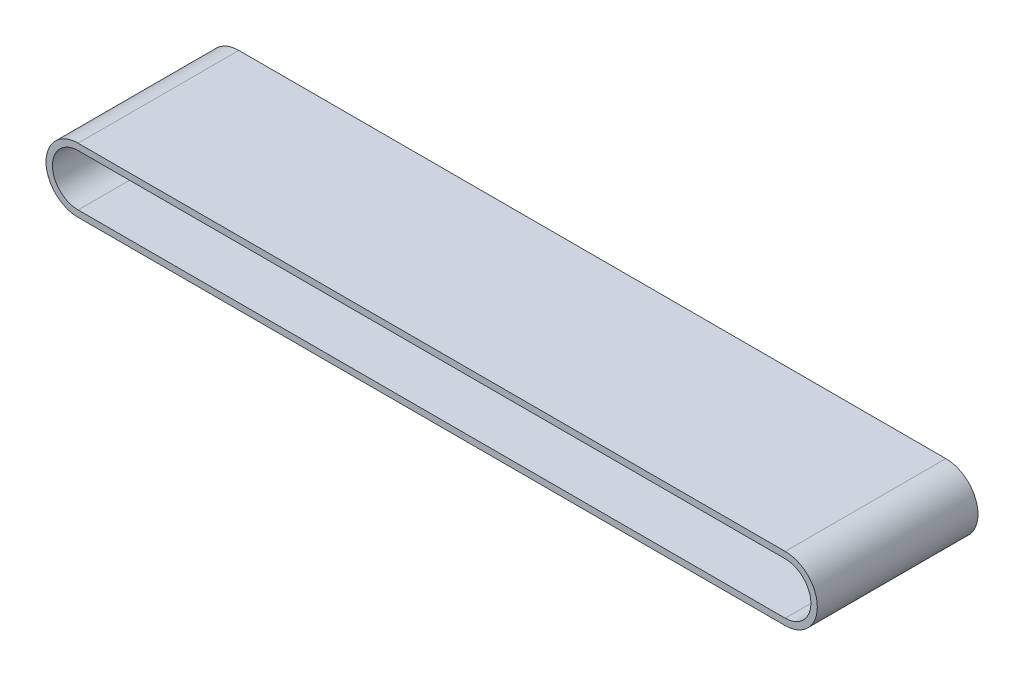
ISO-10303-21;
HEADER;
FILE_DESCRIPTION(('STEP AP214'),'2;1');
FILE_NAME('part.step','',(''),(''),'','','');
FILE_SCHEMA(('AUTOMOTIVE_DESIGN { 1 0 10303 214 1 1 1 1 }'));
ENDSEC;
DATA;
#1=APPLICATION_CONTEXT('core data for automotive mechanical design processes');
#2=APPLICATION_PROTOCOL_DEFINITION('international standard','automotive_design',2000,#1);
#3=PRODUCT_CONTEXT('',#1,'mechanical');
#4=PRODUCT('Part','Part','',(#3));
#5=PRODUCT_RELATED_PRODUCT_CATEGORY('part','',(#4));
#6=PRODUCT_DEFINITION_FORMATION('','',#4);
#7=PRODUCT_DEFINITION_CONTEXT('part definition',#1,'design');
#8=PRODUCT_DEFINITION('design','',#6,#7);
#9=PRODUCT_DEFINITION_SHAPE('','',#8);
#10=(LENGTH_UNIT() NAMED_UNIT(*) SI_UNIT(.MILLI.,.METRE.));
#11=(NAMED_UNIT(*) PLANE_ANGLE_UNIT() SI_UNIT($,.RADIAN.));
#12=(NAMED_UNIT(*) SI_UNIT($,.STERADIAN.) SOLID_ANGLE_UNIT());
#13=UNCERTAINTY_MEASURE_WITH_UNIT(LENGTH_MEASURE(1.E-05),#10,'distance_accuracy_value','');
#14=(GEOMETRIC_REPRESENTATION_CONTEXT(3) GLOBAL_UNCERTAINTY_ASSIGNED_CONTEXT((#13)) GLOBAL_UNIT_ASSIGNED_CONTEXT((#10,
#11,#12)) REPRESENTATION_CONTEXT('',''));
#15=CARTESIAN_POINT('',(0.,0.,0.));
#16=DIRECTION('',(0.,0.,1.));
#17=DIRECTION('',(1.,0.,0.));
#18=AXIS2_PLACEMENT_3D('',#15,#16,#17);
#19=CARTESIAN_POINT('',(-1100.,49.9999999999999,0.));
#20=DIRECTION('',(0.,0.,1.));
#21=DIRECTION('',(1.,0.,0.));
#22=AXIS2_PLACEMENT_3D('',#19,#20,#21);
#23=PLANE('',#22);
#24=CARTESIAN_POINT('',(-1100.,50.,0.));
#25=DIRECTION('',(0.,0.,1.));
#26=DIRECTION('',(1.,0.,0.));
#27=AXIS2_PLACEMENT_3D('',#24,#25,#26);
#28=CIRCLE('',#27,39.9999999999999);
#29=CARTESIAN_POINT('',(-1100.,90.,0.));
#30=VERTEX_POINT('',#29);
#31=CARTESIAN_POINT('',(-1100.,10.,0.));
#32=VERTEX_POINT('',#31);
#33=EDGE_CURVE('E123',#30,#32,#28,.T.);
#34=ORIENTED_EDGE('',*,*,#33,.T.);
#35=DIRECTION('',(1.,0.,0.));
#36=VECTOR('',#35,1.);
#37=CARTESIAN_POINT('',(-1100.,10.,0.));
#38=LINE('',#37,#36);
#39=CARTESIAN_POINT('',(0.,10.,0.));
#40=VERTEX_POINT('',#39);
#41=EDGE_CURVE('E205',#32,#40,#38,.T.);
#42=ORIENTED_EDGE('',*,*,#41,.T.);
#43=CARTESIAN_POINT('',(0.,50.,0.));
#44=DIRECTION('',(0.,0.,1.));
#45=DIRECTION('',(1.,0.,0.));
#46=AXIS2_PLACEMENT_3D('',#43,#44,#45);
#47=CIRCLE('',#46,40.);
#48=CARTESIAN_POINT('',(0.,90.,0.));
#49=VERTEX_POINT('',#48);
#50=EDGE_CURVE('E174',#40,#49,#47,.T.);
#51=ORIENTED_EDGE('',*,*,#50,.T.);
#52=DIRECTION('',(1.,0.,0.));
#53=VECTOR('',#52,1.);
#54=CARTESIAN_POINT('',(-1100.,90.,0.));
#55=LINE('',#54,#53);
#56=EDGE_CURVE('E208',#30,#49,#55,.T.);
#57=ORIENTED_EDGE('',*,*,#56,.F.);
#58=EDGE_LOOP('',(#34,#42,#51,#57));
#59=FACE_BOUND('',#58,.T.);
#60=CARTESIAN_POINT('',(-1100.,49.9999999999999,0.));
#61=DIRECTION('',(0.,0.,1.));
#62=DIRECTION('',(1.,0.,0.));
#63=AXIS2_PLACEMENT_3D('',#60,#61,#62);
#64=CIRCLE('',#63,50.);
#65=CARTESIAN_POINT('',(-1100.,99.9999999999999,0.));
#66=VERTEX_POINT('',#65);
#67=CARTESIAN_POINT('',(-1100.,-1.66533453693773E-13,0.));
#68=VERTEX_POINT('',#67);
#69=EDGE_CURVE('E225',#66,#68,#64,.T.);
#70=ORIENTED_EDGE('',*,*,#69,.F.);
#71=DIRECTION('',(-1.,0.,0.));
#72=VECTOR('',#71,1.);
#73=CARTESIAN_POINT('',(0.,100.,0.));
#74=LINE('',#73,#72);
#75=CARTESIAN_POINT('',(0.,100.,0.));
#76=VERTEX_POINT('',#75);
#77=EDGE_CURVE('E242',#76,#66,#74,.T.);
#78=ORIENTED_EDGE('',*,*,#77,.F.);
#79=CARTESIAN_POINT('',(0.,50.,0.));
#80=DIRECTION('',(0.,0.,1.));
#81=DIRECTION('',(1.,0.,0.));
#82=AXIS2_PLACEMENT_3D('',#79,#80,#81);
#83=CIRCLE('',#82,50.);
#84=CARTESIAN_POINT('',(0.,0.,0.));
#85=VERTEX_POINT('',#84);
#86=EDGE_CURVE('E109',#85,#76,#83,.T.);
#87=ORIENTED_EDGE('',*,*,#86,.F.);
#88=DIRECTION('',(-1.,0.,0.));
#89=VECTOR('',#88,1.);
#90=CARTESIAN_POINT('',(0.,0.,0.));
#91=LINE('',#90,#89);
#92=EDGE_CURVE('E237',#85,#68,#91,.T.);
#93=ORIENTED_EDGE('',*,*,#92,.T.);
#94=EDGE_LOOP('',(#70,#78,#87,#93));
#95=FACE_BOUND('',#94,.T.);
#96=ADVANCED_FACE('F105',(#59,#95),#23,.F.);
#97=CARTESIAN_POINT('',(-1100.,49.9999999999999,250.));
#98=DIRECTION('',(0.,0.,1.));
#99=DIRECTION('',(1.,0.,0.));
#100=AXIS2_PLACEMENT_3D('',#97,#98,#99);
#101=PLANE('',#100);
#102=DIRECTION('',(1.,0.,0.));
#103=VECTOR('',#102,1.);
#104=CARTESIAN_POINT('',(-1100.,10.,250.));
#105=LINE('',#104,#103);
#106=CARTESIAN_POINT('',(-1100.,10.,250.));
#107=VERTEX_POINT('',#106);
#108=CARTESIAN_POINT('',(0.,10.,250.));
#109=VERTEX_POINT('',#108);
#110=EDGE_CURVE('E182',#107,#109,#105,.T.);
#111=ORIENTED_EDGE('',*,*,#110,.F.);
#112=CARTESIAN_POINT('',(-1100.,50.,250.));
#113=DIRECTION('',(0.,0.,1.));
#114=DIRECTION('',(1.,0.,0.));
#115=AXIS2_PLACEMENT_3D('',#112,#113,#114);
#116=CIRCLE('',#115,39.9999999999999);
#117=CARTESIAN_POINT('',(-1100.,90.,250.));
#118=VERTEX_POINT('',#117);
#119=EDGE_CURVE('E218',#118,#107,#116,.T.);
#120=ORIENTED_EDGE('',*,*,#119,.F.);
#121=DIRECTION('',(1.,0.,0.));
#122=VECTOR('',#121,1.);
#123=CARTESIAN_POINT('',(-1100.,90.,250.));
#124=LINE('',#123,#122);
#125=CARTESIAN_POINT('',(0.,90.,250.));
#126=VERTEX_POINT('',#125);
#127=EDGE_CURVE('E189',#118,#126,#124,.T.);
#128=ORIENTED_EDGE('',*,*,#127,.T.);
#129=CARTESIAN_POINT('',(0.,50.,250.));
#130=DIRECTION('',(0.,0.,1.));
#131=DIRECTION('',(1.,0.,0.));
#132=AXIS2_PLACEMENT_3D('',#129,#130,#131);
#133=CIRCLE('',#132,40.);
#134=EDGE_CURVE('E131',#109,#126,#133,.T.);
#135=ORIENTED_EDGE('',*,*,#134,.F.);
#136=EDGE_LOOP('',(#111,#120,#128,#135));
#137=FACE_BOUND('',#136,.T.);
#138=CARTESIAN_POINT('',(-1100.,49.9999999999999,250.));
#139=DIRECTION('',(0.,0.,1.));
#140=DIRECTION('',(1.,0.,0.));
#141=AXIS2_PLACEMENT_3D('',#138,#139,#140);
#142=CIRCLE('',#141,50.);
#143=CARTESIAN_POINT('',(-1100.,99.9999999999999,250.));
#144=VERTEX_POINT('',#143);
#145=CARTESIAN_POINT('',(-1100.,-1.45716771982052E-13,250.));
#146=VERTEX_POINT('',#145);
#147=EDGE_CURVE('E221',#144,#146,#142,.T.);
#148=ORIENTED_EDGE('',*,*,#147,.T.);
#149=DIRECTION('',(-1.,0.,0.));
#150=VECTOR('',#149,1.);
#151=CARTESIAN_POINT('',(0.,0.,250.));
#152=LINE('',#151,#150);
#153=CARTESIAN_POINT('',(0.,0.,250.));
#154=VERTEX_POINT('',#153);
#155=EDGE_CURVE('E236',#154,#146,#152,.T.);
#156=ORIENTED_EDGE('',*,*,#155,.F.);
#157=CARTESIAN_POINT('',(0.,50.,250.));
#158=DIRECTION('',(0.,0.,1.));
#159=DIRECTION('',(1.,0.,0.));
#160=AXIS2_PLACEMENT_3D('',#157,#158,#159);
#161=CIRCLE('',#160,50.);
#162=CARTESIAN_POINT('',(0.,100.,250.));
#163=VERTEX_POINT('',#162);
#164=EDGE_CURVE('E246',#154,#163,#161,.T.);
#165=ORIENTED_EDGE('',*,*,#164,.T.);
#166=DIRECTION('',(-1.,0.,0.));
#167=VECTOR('',#166,1.);
#168=CARTESIAN_POINT('',(0.,100.,250.));
#169=LINE('',#168,#167);
#170=EDGE_CURVE('E232',#163,#144,#169,.T.);
#171=ORIENTED_EDGE('',*,*,#170,.T.);
#172=EDGE_LOOP('',(#148,#156,#165,#171));
#173=FACE_BOUND('',#172,.T.);
#174=ADVANCED_FACE('F192',(#137,#173),#101,.T.);
#175=CARTESIAN_POINT('',(-1100.,49.9999999999999,250.));
#176=DIRECTION('',(0.,0.,-1.));
#177=DIRECTION('',(-1.,0.,0.));
#178=AXIS2_PLACEMENT_3D('',#175,#176,#177);
#179=CYLINDRICAL_SURFACE('',#178,50.);
#180=DIRECTION('',(0.,0.,-1.));
#181=VECTOR('',#180,1.);
#182=CARTESIAN_POINT('',(-1100.,-1.52655665885959E-13,250.));
#183=LINE('',#182,#181);
#184=EDGE_CURVE('E12',#146,#68,#183,.T.);
#185=ORIENTED_EDGE('',*,*,#184,.F.);
#186=ORIENTED_EDGE('',*,*,#147,.F.);
#187=DIRECTION('',(0.,0.,-1.));
#188=VECTOR('',#187,1.);
#189=CARTESIAN_POINT('',(-1100.,99.9999999999999,250.));
#190=LINE('',#189,#188);
#191=EDGE_CURVE('E115',#144,#66,#190,.T.);
#192=ORIENTED_EDGE('',*,*,#191,.T.);
#193=ORIENTED_EDGE('',*,*,#69,.T.);
#194=EDGE_LOOP('',(#185,#186,#192,#193));
#195=FACE_BOUND('',#194,.T.);
#196=ADVANCED_FACE('F270',(#195),#179,.T.);
#197=CARTESIAN_POINT('',(0.,50.,250.));
#198=DIRECTION('',(0.,0.,-1.));
#199=DIRECTION('',(-1.,0.,0.));
#200=AXIS2_PLACEMENT_3D('',#197,#198,#199);
#201=CYLINDRICAL_SURFACE('',#200,50.);
#202=ORIENTED_EDGE('',*,*,#86,.T.);
#203=DIRECTION('',(0.,0.,-1.));
#204=VECTOR('',#203,1.);
#205=CARTESIAN_POINT('',(0.,100.,250.));
#206=LINE('',#205,#204);
#207=EDGE_CURVE('E241',#163,#76,#206,.T.);
#208=ORIENTED_EDGE('',*,*,#207,.F.);
#209=ORIENTED_EDGE('',*,*,#164,.F.);
#210=DIRECTION('',(0.,0.,-1.));
#211=VECTOR('',#210,1.);
#212=CARTESIAN_POINT('',(0.,0.,250.));
#213=LINE('',#212,#211);
#214=EDGE_CURVE('E229',#154,#85,#213,.T.);
#215=ORIENTED_EDGE('',*,*,#214,.T.);
#216=EDGE_LOOP('',(#202,#208,#209,#215));
#217=FACE_BOUND('',#216,.T.);
#218=ADVANCED_FACE('F107',(#217),#201,.T.);
#219=CARTESIAN_POINT('',(0.,100.,250.));
#220=DIRECTION('',(0.,-1.,0.));
#221=DIRECTION('',(1.,0.,0.));
#222=AXIS2_PLACEMENT_3D('',#219,#220,#221);
#223=PLANE('',#222);
#224=ORIENTED_EDGE('',*,*,#77,.T.);
#225=ORIENTED_EDGE('',*,*,#191,.F.);
#226=ORIENTED_EDGE('',*,*,#170,.F.);
#227=ORIENTED_EDGE('',*,*,#207,.T.);
#228=EDGE_LOOP('',(#224,#225,#226,#227));
#229=FACE_BOUND('',#228,.T.);
#230=ADVANCED_FACE('F267',(#229),#223,.F.);
#231=CARTESIAN_POINT('',(0.,0.,250.));
#232=DIRECTION('',(0.,-1.,0.));
#233=DIRECTION('',(1.,0.,0.));
#234=AXIS2_PLACEMENT_3D('',#231,#232,#233);
#235=PLANE('',#234);
#236=ORIENTED_EDGE('',*,*,#92,.F.);
#237=ORIENTED_EDGE('',*,*,#214,.F.);
#238=ORIENTED_EDGE('',*,*,#155,.T.);
#239=ORIENTED_EDGE('',*,*,#184,.T.);
#240=EDGE_LOOP('',(#236,#237,#238,#239));
#241=FACE_BOUND('',#240,.T.);
#242=ADVANCED_FACE('F272',(#241),#235,.T.);
#243=CARTESIAN_POINT('',(0.,50.,0.));
#244=DIRECTION('',(0.,0.,1.));
#245=DIRECTION('',(1.,0.,0.));
#246=AXIS2_PLACEMENT_3D('',#243,#244,#245);
#247=CYLINDRICAL_SURFACE('',#246,40.);
#248=ORIENTED_EDGE('',*,*,#134,.T.);
#249=DIRECTION('',(0.,0.,1.));
#250=VECTOR('',#249,1.);
#251=CARTESIAN_POINT('',(0.,90.,0.));
#252=LINE('',#251,#250);
#253=EDGE_CURVE('E179',#126,#49,#252,.F.);
#254=ORIENTED_EDGE('',*,*,#253,.T.);
#255=ORIENTED_EDGE('',*,*,#50,.F.);
#256=DIRECTION('',(0.,0.,1.));
#257=VECTOR('',#256,1.);
#258=CARTESIAN_POINT('',(0.,10.,0.));
#259=LINE('',#258,#257);
#260=EDGE_CURVE('E170',#109,#40,#259,.F.);
#261=ORIENTED_EDGE('',*,*,#260,.F.);
#262=EDGE_LOOP('',(#248,#254,#255,#261));
#263=FACE_BOUND('',#262,.T.);
#264=ADVANCED_FACE('F172',(#263),#247,.F.);
#265=CARTESIAN_POINT('',(-1100.,50.,0.));
#266=DIRECTION('',(0.,0.,1.));
#267=DIRECTION('',(1.,0.,0.));
#268=AXIS2_PLACEMENT_3D('',#265,#266,#267);
#269=CYLINDRICAL_SURFACE('',#268,39.9999999999999);
#270=ORIENTED_EDGE('',*,*,#33,.F.);
#271=DIRECTION('',(0.,0.,1.));
#272=VECTOR('',#271,1.);
#273=CARTESIAN_POINT('',(-1100.,90.,0.));
#274=LINE('',#273,#272);
#275=EDGE_CURVE('E200',#30,#118,#274,.T.);
#276=ORIENTED_EDGE('',*,*,#275,.T.);
#277=ORIENTED_EDGE('',*,*,#119,.T.);
#278=DIRECTION('',(0.,0.,1.));
#279=VECTOR('',#278,1.);
#280=CARTESIAN_POINT('',(-1100.,10.,0.));
#281=LINE('',#280,#279);
#282=EDGE_CURVE('E184',#32,#107,#281,.T.);
#283=ORIENTED_EDGE('',*,*,#282,.F.);
#284=EDGE_LOOP('',(#270,#276,#277,#283));
#285=FACE_BOUND('',#284,.T.);
#286=ADVANCED_FACE('F280',(#285),#269,.F.);
#287=CARTESIAN_POINT('',(-1100.,10.,0.));
#288=DIRECTION('',(0.,-1.,0.));
#289=DIRECTION('',(1.,0.,0.));
#290=AXIS2_PLACEMENT_3D('',#287,#288,#289);
#291=PLANE('',#290);
#292=ORIENTED_EDGE('',*,*,#110,.T.);
#293=ORIENTED_EDGE('',*,*,#260,.T.);
#294=ORIENTED_EDGE('',*,*,#41,.F.);
#295=ORIENTED_EDGE('',*,*,#282,.T.);
#296=EDGE_LOOP('',(#292,#293,#294,#295));
#297=FACE_BOUND('',#296,.T.);
#298=ADVANCED_FACE('F183',(#297),#291,.F.);
#299=CARTESIAN_POINT('',(-1100.,90.,0.));
#300=DIRECTION('',(0.,-1.,0.));
#301=DIRECTION('',(1.,0.,0.));
#302=AXIS2_PLACEMENT_3D('',#299,#300,#301);
#303=PLANE('',#302);
#304=ORIENTED_EDGE('',*,*,#127,.F.);
#305=ORIENTED_EDGE('',*,*,#275,.F.);
#306=ORIENTED_EDGE('',*,*,#56,.T.);
#307=ORIENTED_EDGE('',*,*,#253,.F.);
#308=EDGE_LOOP('',(#304,#305,#306,#307));
#309=FACE_BOUND('',#308,.T.);
#310=ADVANCED_FACE('F293',(#309),#303,.T.);
#311=CLOSED_SHELL('',(#96,#174,#196,#218,#230,#242,#264,#286,#298,#310));
#312=MANIFOLD_SOLID_BREP('B2',#311);
#313=ADVANCED_BREP_SHAPE_REPRESENTATION('',(#18,#312),#14);
#314=SHAPE_DEFINITION_REPRESENTATION(#9,#313);
ENDSEC;
END-ISO-10303-21;
